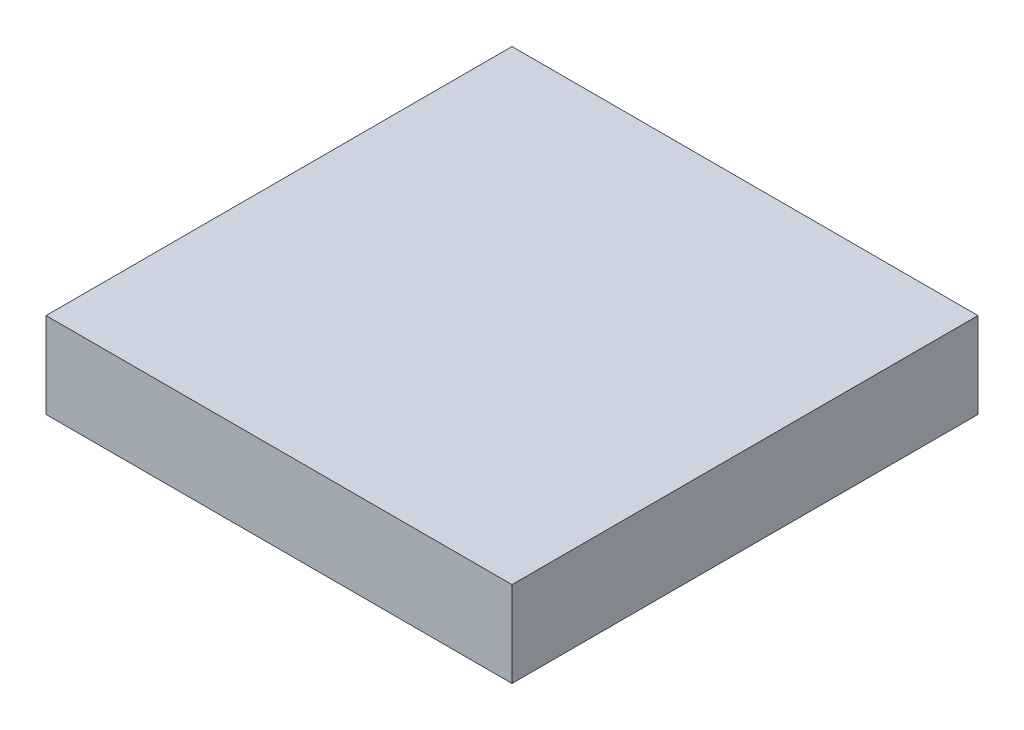
ISO-10303-21;
HEADER;
FILE_DESCRIPTION(('STEP AP214'),'2;1');
FILE_NAME('part.step','',(''),(''),'','','');
FILE_SCHEMA(('AUTOMOTIVE_DESIGN { 1 0 10303 214 1 1 1 1 }'));
ENDSEC;
DATA;
#1=APPLICATION_CONTEXT('core data for automotive mechanical design processes');
#2=APPLICATION_PROTOCOL_DEFINITION('international standard','automotive_design',2000,#1);
#3=PRODUCT_CONTEXT('',#1,'mechanical');
#4=PRODUCT('Part','Part','',(#3));
#5=PRODUCT_RELATED_PRODUCT_CATEGORY('part','',(#4));
#6=PRODUCT_DEFINITION_FORMATION('','',#4);
#7=PRODUCT_DEFINITION_CONTEXT('part definition',#1,'design');
#8=PRODUCT_DEFINITION('design','',#6,#7);
#9=PRODUCT_DEFINITION_SHAPE('','',#8);
#10=(LENGTH_UNIT() NAMED_UNIT(*) SI_UNIT(.MILLI.,.METRE.));
#11=(NAMED_UNIT(*) PLANE_ANGLE_UNIT() SI_UNIT($,.RADIAN.));
#12=(NAMED_UNIT(*) SI_UNIT($,.STERADIAN.) SOLID_ANGLE_UNIT());
#13=UNCERTAINTY_MEASURE_WITH_UNIT(LENGTH_MEASURE(1.E-05),#10,'distance_accuracy_value','');
#14=(GEOMETRIC_REPRESENTATION_CONTEXT(3) GLOBAL_UNCERTAINTY_ASSIGNED_CONTEXT((#13)) GLOBAL_UNIT_ASSIGNED_CONTEXT((#10,
#11,#12)) REPRESENTATION_CONTEXT('',''));
#15=CARTESIAN_POINT('',(0.,0.,0.));
#16=DIRECTION('',(0.,0.,1.));
#17=DIRECTION('',(1.,0.,0.));
#18=AXIS2_PLACEMENT_3D('',#15,#16,#17);
#19=CARTESIAN_POINT('',(7.62,2.8,7.62));
#20=DIRECTION('',(-1.,0.,0.));
#21=DIRECTION('',(0.,0.,1.));
#22=AXIS2_PLACEMENT_3D('',#19,#20,#21);
#23=PLANE('',#22);
#24=DIRECTION('',(0.,0.,-1.));
#25=VECTOR('',#24,1.);
#26=CARTESIAN_POINT('',(7.62,0.,7.62));
#27=LINE('',#26,#25);
#28=CARTESIAN_POINT('',(7.62,0.,7.62));
#29=VERTEX_POINT('',#28);
#30=CARTESIAN_POINT('',(7.62,0.,-7.62));
#31=VERTEX_POINT('',#30);
#32=EDGE_CURVE('E113',#29,#31,#27,.T.);
#33=ORIENTED_EDGE('',*,*,#32,.T.);
#34=DIRECTION('',(0.,-1.,0.));
#35=VECTOR('',#34,1.);
#36=CARTESIAN_POINT('',(7.62,2.8,-7.62));
#37=LINE('',#36,#35);
#38=CARTESIAN_POINT('',(7.62,2.8,-7.62));
#39=VERTEX_POINT('',#38);
#40=EDGE_CURVE('E11',#39,#31,#37,.T.);
#41=ORIENTED_EDGE('',*,*,#40,.F.);
#42=DIRECTION('',(0.,0.,-1.));
#43=VECTOR('',#42,1.);
#44=CARTESIAN_POINT('',(7.62,2.8,7.62));
#45=LINE('',#44,#43);
#46=CARTESIAN_POINT('',(7.62,2.8,7.62));
#47=VERTEX_POINT('',#46);
#48=EDGE_CURVE('E97',#47,#39,#45,.T.);
#49=ORIENTED_EDGE('',*,*,#48,.F.);
#50=DIRECTION('',(0.,-1.,0.));
#51=VECTOR('',#50,1.);
#52=CARTESIAN_POINT('',(7.62,2.8,7.62));
#53=LINE('',#52,#51);
#54=EDGE_CURVE('E109',#47,#29,#53,.T.);
#55=ORIENTED_EDGE('',*,*,#54,.T.);
#56=EDGE_LOOP('',(#33,#41,#49,#55));
#57=FACE_BOUND('',#56,.T.);
#58=ADVANCED_FACE('F45',(#57),#23,.F.);
#59=CARTESIAN_POINT('',(-7.62,2.8,-7.62));
#60=DIRECTION('',(0.,0.,1.));
#61=DIRECTION('',(1.,0.,0.));
#62=AXIS2_PLACEMENT_3D('',#59,#60,#61);
#63=PLANE('',#62);
#64=DIRECTION('',(-1.,0.,0.));
#65=VECTOR('',#64,1.);
#66=CARTESIAN_POINT('',(-7.62,0.,-7.62));
#67=LINE('',#66,#65);
#68=CARTESIAN_POINT('',(-7.62,0.,-7.62));
#69=VERTEX_POINT('',#68);
#70=EDGE_CURVE('E102',#31,#69,#67,.T.);
#71=ORIENTED_EDGE('',*,*,#70,.T.);
#72=DIRECTION('',(0.,-1.,0.));
#73=VECTOR('',#72,1.);
#74=CARTESIAN_POINT('',(-7.62,2.8,-7.62));
#75=LINE('',#74,#73);
#76=CARTESIAN_POINT('',(-7.62,2.8,-7.62));
#77=VERTEX_POINT('',#76);
#78=EDGE_CURVE('E54',#77,#69,#75,.T.);
#79=ORIENTED_EDGE('',*,*,#78,.F.);
#80=DIRECTION('',(-1.,0.,0.));
#81=VECTOR('',#80,1.);
#82=CARTESIAN_POINT('',(-7.62,2.8,-7.62));
#83=LINE('',#82,#81);
#84=EDGE_CURVE('E92',#39,#77,#83,.T.);
#85=ORIENTED_EDGE('',*,*,#84,.F.);
#86=ORIENTED_EDGE('',*,*,#40,.T.);
#87=EDGE_LOOP('',(#71,#79,#85,#86));
#88=FACE_BOUND('',#87,.T.);
#89=ADVANCED_FACE('F101',(#88),#63,.F.);
#90=CARTESIAN_POINT('',(-7.62,2.8,7.62));
#91=DIRECTION('',(1.,0.,0.));
#92=DIRECTION('',(0.,0.,-1.));
#93=AXIS2_PLACEMENT_3D('',#90,#91,#92);
#94=PLANE('',#93);
#95=DIRECTION('',(0.,0.,1.));
#96=VECTOR('',#95,1.);
#97=CARTESIAN_POINT('',(-7.62,0.,7.62));
#98=LINE('',#97,#96);
#99=CARTESIAN_POINT('',(-7.62,0.,7.62));
#100=VERTEX_POINT('',#99);
#101=EDGE_CURVE('E79',#69,#100,#98,.T.);
#102=ORIENTED_EDGE('',*,*,#101,.T.);
#103=DIRECTION('',(0.,-1.,0.));
#104=VECTOR('',#103,1.);
#105=CARTESIAN_POINT('',(-7.62,2.8,7.62));
#106=LINE('',#105,#104);
#107=CARTESIAN_POINT('',(-7.62,2.8,7.62));
#108=VERTEX_POINT('',#107);
#109=EDGE_CURVE('E104',#108,#100,#106,.T.);
#110=ORIENTED_EDGE('',*,*,#109,.F.);
#111=DIRECTION('',(0.,0.,1.));
#112=VECTOR('',#111,1.);
#113=CARTESIAN_POINT('',(-7.62,2.8,7.62));
#114=LINE('',#113,#112);
#115=EDGE_CURVE('E95',#77,#108,#114,.T.);
#116=ORIENTED_EDGE('',*,*,#115,.F.);
#117=ORIENTED_EDGE('',*,*,#78,.T.);
#118=EDGE_LOOP('',(#102,#110,#116,#117));
#119=FACE_BOUND('',#118,.T.);
#120=ADVANCED_FACE('F105',(#119),#94,.F.);
#121=CARTESIAN_POINT('',(-7.62,2.8,7.62));
#122=DIRECTION('',(0.,0.,-1.));
#123=DIRECTION('',(-1.,0.,0.));
#124=AXIS2_PLACEMENT_3D('',#121,#122,#123);
#125=PLANE('',#124);
#126=DIRECTION('',(1.,0.,0.));
#127=VECTOR('',#126,1.);
#128=CARTESIAN_POINT('',(-7.62,0.,7.62));
#129=LINE('',#128,#127);
#130=EDGE_CURVE('E85',#100,#29,#129,.T.);
#131=ORIENTED_EDGE('',*,*,#130,.T.);
#132=ORIENTED_EDGE('',*,*,#54,.F.);
#133=DIRECTION('',(1.,0.,0.));
#134=VECTOR('',#133,1.);
#135=CARTESIAN_POINT('',(-7.62,2.8,7.62));
#136=LINE('',#135,#134);
#137=EDGE_CURVE('E62',#108,#47,#136,.T.);
#138=ORIENTED_EDGE('',*,*,#137,.F.);
#139=ORIENTED_EDGE('',*,*,#109,.T.);
#140=EDGE_LOOP('',(#131,#132,#138,#139));
#141=FACE_BOUND('',#140,.T.);
#142=ADVANCED_FACE('F126',(#141),#125,.F.);
#143=CARTESIAN_POINT('',(0.,2.8,0.));
#144=DIRECTION('',(0.,-1.,0.));
#145=DIRECTION('',(0.,0.,-1.));
#146=AXIS2_PLACEMENT_3D('',#143,#144,#145);
#147=PLANE('',#146);
#148=ORIENTED_EDGE('',*,*,#48,.T.);
#149=ORIENTED_EDGE('',*,*,#84,.T.);
#150=ORIENTED_EDGE('',*,*,#115,.T.);
#151=ORIENTED_EDGE('',*,*,#137,.T.);
#152=EDGE_LOOP('',(#148,#149,#150,#151));
#153=FACE_BOUND('',#152,.T.);
#154=ADVANCED_FACE('F93',(#153),#147,.F.);
#155=CARTESIAN_POINT('',(0.,0.,0.));
#156=DIRECTION('',(0.,-1.,0.));
#157=DIRECTION('',(0.,0.,-1.));
#158=AXIS2_PLACEMENT_3D('',#155,#156,#157);
#159=PLANE('',#158);
#160=ORIENTED_EDGE('',*,*,#32,.F.);
#161=ORIENTED_EDGE('',*,*,#130,.F.);
#162=ORIENTED_EDGE('',*,*,#101,.F.);
#163=ORIENTED_EDGE('',*,*,#70,.F.);
#164=EDGE_LOOP('',(#160,#161,#162,#163));
#165=FACE_BOUND('',#164,.T.);
#166=ADVANCED_FACE('F129',(#165),#159,.T.);
#167=CLOSED_SHELL('',(#58,#89,#120,#142,#154,#166));
#168=MANIFOLD_SOLID_BREP('B2',#167);
#169=ADVANCED_BREP_SHAPE_REPRESENTATION('',(#18,#168),#14);
#170=SHAPE_DEFINITION_REPRESENTATION(#9,#169);
ENDSEC;
END-ISO-10303-21;
